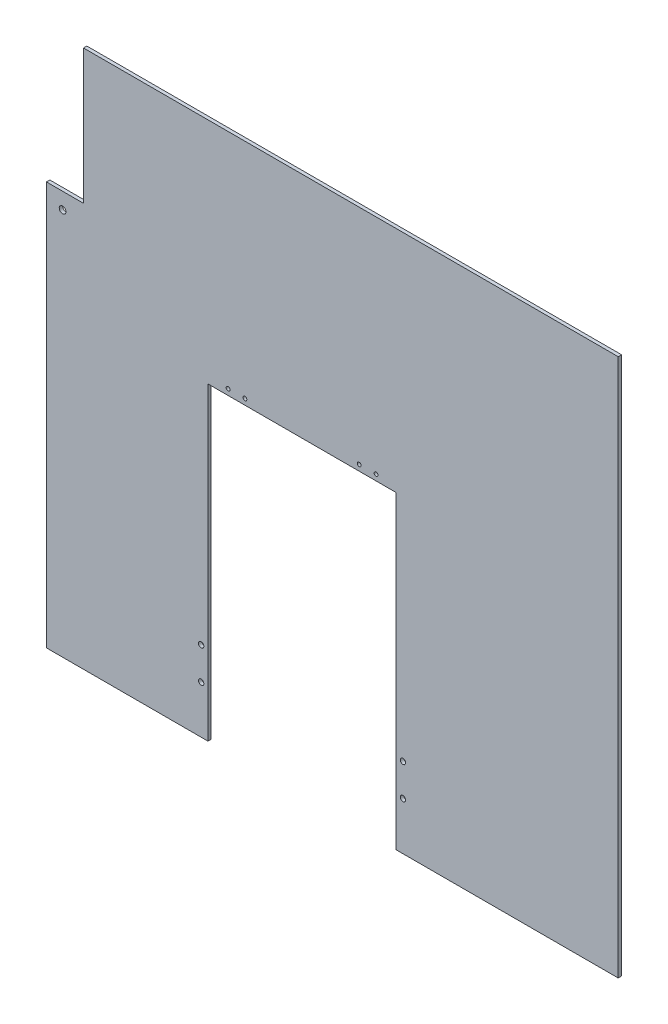
ISO-10303-21;
HEADER;
FILE_DESCRIPTION(('STEP AP214'),'2;1');
FILE_NAME('part.step','',(''),(''),'','','');
FILE_SCHEMA(('AUTOMOTIVE_DESIGN { 1 0 10303 214 1 1 1 1 }'));
ENDSEC;
DATA;
#1=APPLICATION_CONTEXT('core data for automotive mechanical design processes');
#2=APPLICATION_PROTOCOL_DEFINITION('international standard','automotive_design',2000,#1);
#3=PRODUCT_CONTEXT('',#1,'mechanical');
#4=PRODUCT('Part','Part','',(#3));
#5=PRODUCT_RELATED_PRODUCT_CATEGORY('part','',(#4));
#6=PRODUCT_DEFINITION_FORMATION('','',#4);
#7=PRODUCT_DEFINITION_CONTEXT('part definition',#1,'design');
#8=PRODUCT_DEFINITION('design','',#6,#7);
#9=PRODUCT_DEFINITION_SHAPE('','',#8);
#10=(LENGTH_UNIT() NAMED_UNIT(*) SI_UNIT(.MILLI.,.METRE.));
#11=(NAMED_UNIT(*) PLANE_ANGLE_UNIT() SI_UNIT($,.RADIAN.));
#12=(NAMED_UNIT(*) SI_UNIT($,.STERADIAN.) SOLID_ANGLE_UNIT());
#13=UNCERTAINTY_MEASURE_WITH_UNIT(LENGTH_MEASURE(1.E-05),#10,'distance_accuracy_value','');
#14=(GEOMETRIC_REPRESENTATION_CONTEXT(3) GLOBAL_UNCERTAINTY_ASSIGNED_CONTEXT((#13)) GLOBAL_UNIT_ASSIGNED_CONTEXT((#10,
#11,#12)) REPRESENTATION_CONTEXT('',''));
#15=CARTESIAN_POINT('',(0.,0.,0.));
#16=DIRECTION('',(0.,0.,1.));
#17=DIRECTION('',(1.,0.,0.));
#18=AXIS2_PLACEMENT_3D('',#15,#16,#17);
#19=CARTESIAN_POINT('',(0.,0.,3.175));
#20=DIRECTION('',(0.,1.,0.));
#21=DIRECTION('',(0.,0.,1.));
#22=AXIS2_PLACEMENT_3D('',#19,#20,#21);
#23=PLANE('',#22);
#24=DIRECTION('',(1.,0.,0.));
#25=VECTOR('',#24,1.);
#26=CARTESIAN_POINT('',(0.,0.,0.));
#27=LINE('',#26,#25);
#28=CARTESIAN_POINT('',(0.,0.,0.));
#29=VERTEX_POINT('',#28);
#30=CARTESIAN_POINT('',(152.4,0.,0.));
#31=VERTEX_POINT('',#30);
#32=EDGE_CURVE('E161',#29,#31,#27,.T.);
#33=ORIENTED_EDGE('',*,*,#32,.T.);
#34=DIRECTION('',(0.,0.,-1.));
#35=VECTOR('',#34,1.);
#36=CARTESIAN_POINT('',(152.4,0.,44.45));
#37=LINE('',#36,#35);
#38=CARTESIAN_POINT('',(152.4,0.,3.175));
#39=VERTEX_POINT('',#38);
#40=EDGE_CURVE('E216',#39,#31,#37,.T.);
#41=ORIENTED_EDGE('',*,*,#40,.F.);
#42=DIRECTION('',(1.,0.,0.));
#43=VECTOR('',#42,1.);
#44=CARTESIAN_POINT('',(0.,0.,3.175));
#45=LINE('',#44,#43);
#46=CARTESIAN_POINT('',(0.,0.,3.175));
#47=VERTEX_POINT('',#46);
#48=EDGE_CURVE('E152',#47,#39,#45,.T.);
#49=ORIENTED_EDGE('',*,*,#48,.F.);
#50=DIRECTION('',(0.,0.,-1.));
#51=VECTOR('',#50,1.);
#52=CARTESIAN_POINT('',(0.,0.,3.175));
#53=LINE('',#52,#51);
#54=EDGE_CURVE('E11',#47,#29,#53,.T.);
#55=ORIENTED_EDGE('',*,*,#54,.T.);
#56=EDGE_LOOP('',(#33,#41,#49,#55));
#57=FACE_BOUND('',#56,.T.);
#58=ADVANCED_FACE('F43',(#57),#23,.F.);
#59=CARTESIAN_POINT('',(0.,0.,3.175));
#60=DIRECTION('',(1.,0.,0.));
#61=DIRECTION('',(0.,0.,-1.));
#62=AXIS2_PLACEMENT_3D('',#59,#60,#61);
#63=PLANE('',#62);
#64=DIRECTION('',(0.,-1.,0.));
#65=VECTOR('',#64,1.);
#66=CARTESIAN_POINT('',(0.,0.,3.175));
#67=LINE('',#66,#65);
#68=CARTESIAN_POINT('',(0.,381.,3.175));
#69=VERTEX_POINT('',#68);
#70=EDGE_CURVE('E169',#69,#47,#67,.T.);
#71=ORIENTED_EDGE('',*,*,#70,.F.);
#72=DIRECTION('',(0.,0.,-1.));
#73=VECTOR('',#72,1.);
#74=CARTESIAN_POINT('',(0.,381.,3.175));
#75=LINE('',#74,#73);
#76=CARTESIAN_POINT('',(0.,381.,0.));
#77=VERTEX_POINT('',#76);
#78=EDGE_CURVE('E197',#69,#77,#75,.T.);
#79=ORIENTED_EDGE('',*,*,#78,.T.);
#80=DIRECTION('',(0.,-1.,0.));
#81=VECTOR('',#80,1.);
#82=CARTESIAN_POINT('',(0.,0.,0.));
#83=LINE('',#82,#81);
#84=EDGE_CURVE('E156',#77,#29,#83,.T.);
#85=ORIENTED_EDGE('',*,*,#84,.T.);
#86=ORIENTED_EDGE('',*,*,#54,.F.);
#87=EDGE_LOOP('',(#71,#79,#85,#86));
#88=FACE_BOUND('',#87,.T.);
#89=ADVANCED_FACE('F45',(#88),#63,.F.);
#90=CARTESIAN_POINT('',(330.2,0.,3.175));
#91=VERTEX_POINT('',#90);
#92=CARTESIAN_POINT('',(539.75,0.,3.175));
#93=VERTEX_POINT('',#92);
#94=EDGE_CURVE('E261',#91,#93,#45,.T.);
#95=ORIENTED_EDGE('',*,*,#94,.F.);
#96=DIRECTION('',(0.,0.,-1.));
#97=VECTOR('',#96,1.);
#98=CARTESIAN_POINT('',(330.2,0.,44.45));
#99=LINE('',#98,#97);
#100=CARTESIAN_POINT('',(330.2,0.,0.));
#101=VERTEX_POINT('',#100);
#102=EDGE_CURVE('E229',#91,#101,#99,.T.);
#103=ORIENTED_EDGE('',*,*,#102,.T.);
#104=CARTESIAN_POINT('',(539.75,0.,0.));
#105=VERTEX_POINT('',#104);
#106=EDGE_CURVE('E159',#101,#105,#27,.T.);
#107=ORIENTED_EDGE('',*,*,#106,.T.);
#108=DIRECTION('',(0.,0.,-1.));
#109=VECTOR('',#108,1.);
#110=CARTESIAN_POINT('',(539.75,0.,3.175));
#111=LINE('',#110,#109);
#112=EDGE_CURVE('E52',#93,#105,#111,.T.);
#113=ORIENTED_EDGE('',*,*,#112,.F.);
#114=EDGE_LOOP('',(#95,#103,#107,#113));
#115=FACE_BOUND('',#114,.T.);
#116=ADVANCED_FACE('F266',(#115),#23,.F.);
#117=CARTESIAN_POINT('',(539.75,0.,3.175));
#118=DIRECTION('',(-1.,0.,0.));
#119=DIRECTION('',(0.,0.,1.));
#120=AXIS2_PLACEMENT_3D('',#117,#118,#119);
#121=PLANE('',#120);
#122=DIRECTION('',(0.,1.,0.));
#123=VECTOR('',#122,1.);
#124=CARTESIAN_POINT('',(539.75,0.,0.));
#125=LINE('',#124,#123);
#126=CARTESIAN_POINT('',(539.75,508.,0.));
#127=VERTEX_POINT('',#126);
#128=EDGE_CURVE('E165',#105,#127,#125,.T.);
#129=ORIENTED_EDGE('',*,*,#128,.T.);
#130=DIRECTION('',(0.,0.,-1.));
#131=VECTOR('',#130,1.);
#132=CARTESIAN_POINT('',(539.75,508.,3.175));
#133=LINE('',#132,#131);
#134=CARTESIAN_POINT('',(539.75,508.,3.175));
#135=VERTEX_POINT('',#134);
#136=EDGE_CURVE('E147',#135,#127,#133,.T.);
#137=ORIENTED_EDGE('',*,*,#136,.F.);
#138=DIRECTION('',(0.,1.,0.));
#139=VECTOR('',#138,1.);
#140=CARTESIAN_POINT('',(539.75,0.,3.175));
#141=LINE('',#140,#139);
#142=EDGE_CURVE('E144',#93,#135,#141,.T.);
#143=ORIENTED_EDGE('',*,*,#142,.F.);
#144=ORIENTED_EDGE('',*,*,#112,.T.);
#145=EDGE_LOOP('',(#129,#137,#143,#144));
#146=FACE_BOUND('',#145,.T.);
#147=ADVANCED_FACE('F175',(#146),#121,.F.);
#148=CARTESIAN_POINT('',(0.,508.,3.175));
#149=DIRECTION('',(0.,-1.,0.));
#150=DIRECTION('',(0.,0.,-1.));
#151=AXIS2_PLACEMENT_3D('',#148,#149,#150);
#152=PLANE('',#151);
#153=DIRECTION('',(-1.,0.,0.));
#154=VECTOR('',#153,1.);
#155=CARTESIAN_POINT('',(0.,508.,0.));
#156=LINE('',#155,#154);
#157=CARTESIAN_POINT('',(34.925,508.,0.));
#158=VERTEX_POINT('',#157);
#159=EDGE_CURVE('E139',#127,#158,#156,.T.);
#160=ORIENTED_EDGE('',*,*,#159,.T.);
#161=DIRECTION('',(0.,0.,-1.));
#162=VECTOR('',#161,1.);
#163=CARTESIAN_POINT('',(34.925,508.,3.175));
#164=LINE('',#163,#162);
#165=CARTESIAN_POINT('',(34.925,508.,3.175));
#166=VERTEX_POINT('',#165);
#167=EDGE_CURVE('E59',#166,#158,#164,.T.);
#168=ORIENTED_EDGE('',*,*,#167,.F.);
#169=DIRECTION('',(-1.,0.,0.));
#170=VECTOR('',#169,1.);
#171=CARTESIAN_POINT('',(0.,508.,3.175));
#172=LINE('',#171,#170);
#173=EDGE_CURVE('E137',#135,#166,#172,.T.);
#174=ORIENTED_EDGE('',*,*,#173,.F.);
#175=ORIENTED_EDGE('',*,*,#136,.T.);
#176=EDGE_LOOP('',(#160,#168,#174,#175));
#177=FACE_BOUND('',#176,.T.);
#178=ADVANCED_FACE('F135',(#177),#152,.F.);
#179=CARTESIAN_POINT('',(0.,0.,3.175));
#180=DIRECTION('',(0.,0.,-1.));
#181=DIRECTION('',(-1.,0.,0.));
#182=AXIS2_PLACEMENT_3D('',#179,#180,#181);
#183=PLANE('',#182);
#184=CARTESIAN_POINT('',(336.55,75.565,3.175));
#185=DIRECTION('',(0.,0.,1.));
#186=DIRECTION('',(1.,0.,0.));
#187=AXIS2_PLACEMENT_3D('',#184,#185,#186);
#188=CIRCLE('',#187,2.54000000000001);
#189=CARTESIAN_POINT('',(339.09,75.565,3.175));
#190=VERTEX_POINT('',#189);
#191=EDGE_CURVE('E513',#190,#190,#188,.T.);
#192=ORIENTED_EDGE('',*,*,#191,.F.);
#193=EDGE_LOOP('',(#192));
#194=FACE_BOUND('',#193,.T.);
#195=CARTESIAN_POINT('',(146.05,75.565,3.175));
#196=DIRECTION('',(0.,0.,1.));
#197=DIRECTION('',(1.,0.,0.));
#198=AXIS2_PLACEMENT_3D('',#195,#196,#197);
#199=CIRCLE('',#198,2.53999999999998);
#200=CARTESIAN_POINT('',(148.59,75.565,3.175));
#201=VERTEX_POINT('',#200);
#202=EDGE_CURVE('E517',#201,#201,#199,.T.);
#203=ORIENTED_EDGE('',*,*,#202,.F.);
#204=EDGE_LOOP('',(#203));
#205=FACE_BOUND('',#204,.T.);
#206=CARTESIAN_POINT('',(311.1754,297.6372,3.175));
#207=DIRECTION('',(0.,0.,-1.));
#208=DIRECTION('',(-1.,0.,0.));
#209=AXIS2_PLACEMENT_3D('',#206,#207,#208);
#210=CIRCLE('',#209,1.80339999999999);
#211=CARTESIAN_POINT('',(309.372,297.6372,3.175));
#212=VERTEX_POINT('',#211);
#213=EDGE_CURVE('E187',#212,#212,#210,.T.);
#214=ORIENTED_EDGE('',*,*,#213,.T.);
#215=EDGE_LOOP('',(#214));
#216=FACE_BOUND('',#215,.T.);
#217=CARTESIAN_POINT('',(295.3004,297.6372,3.175));
#218=DIRECTION('',(0.,0.,-1.));
#219=DIRECTION('',(-1.,0.,0.));
#220=AXIS2_PLACEMENT_3D('',#217,#218,#219);
#221=CIRCLE('',#220,1.80340000000004);
#222=CARTESIAN_POINT('',(293.497,297.6372,3.175));
#223=VERTEX_POINT('',#222);
#224=EDGE_CURVE('E535',#223,#223,#221,.T.);
#225=ORIENTED_EDGE('',*,*,#224,.T.);
#226=EDGE_LOOP('',(#225));
#227=FACE_BOUND('',#226,.T.);
#228=CARTESIAN_POINT('',(187.3504,297.6372,3.175));
#229=DIRECTION('',(0.,0.,-1.));
#230=DIRECTION('',(-1.,0.,0.));
#231=AXIS2_PLACEMENT_3D('',#228,#229,#230);
#232=CIRCLE('',#231,1.80340000000004);
#233=CARTESIAN_POINT('',(185.547,297.6372,3.175));
#234=VERTEX_POINT('',#233);
#235=EDGE_CURVE('E543',#234,#234,#232,.T.);
#236=ORIENTED_EDGE('',*,*,#235,.T.);
#237=EDGE_LOOP('',(#236));
#238=FACE_BOUND('',#237,.T.);
#239=CARTESIAN_POINT('',(171.4754,297.6372,3.175));
#240=DIRECTION('',(0.,0.,-1.));
#241=DIRECTION('',(-1.,0.,0.));
#242=AXIS2_PLACEMENT_3D('',#239,#240,#241);
#243=CIRCLE('',#242,1.80340000000004);
#244=CARTESIAN_POINT('',(169.672,297.6372,3.175));
#245=VERTEX_POINT('',#244);
#246=EDGE_CURVE('E524',#245,#245,#243,.T.);
#247=ORIENTED_EDGE('',*,*,#246,.T.);
#248=EDGE_LOOP('',(#247));
#249=FACE_BOUND('',#248,.T.);
#250=CARTESIAN_POINT('',(336.55,45.085,3.175));
#251=DIRECTION('',(0.,0.,-1.));
#252=DIRECTION('',(-1.,0.,0.));
#253=AXIS2_PLACEMENT_3D('',#250,#251,#252);
#254=CIRCLE('',#253,2.54000000000001);
#255=CARTESIAN_POINT('',(334.01,45.085,3.175));
#256=VERTEX_POINT('',#255);
#257=EDGE_CURVE('E160',#256,#256,#254,.T.);
#258=ORIENTED_EDGE('',*,*,#257,.T.);
#259=EDGE_LOOP('',(#258));
#260=FACE_BOUND('',#259,.T.);
#261=CARTESIAN_POINT('',(146.05,45.085,3.175));
#262=DIRECTION('',(0.,0.,-1.));
#263=DIRECTION('',(-1.,0.,0.));
#264=AXIS2_PLACEMENT_3D('',#261,#262,#263);
#265=CIRCLE('',#264,2.53999999999998);
#266=CARTESIAN_POINT('',(143.51,45.085,3.175));
#267=VERTEX_POINT('',#266);
#268=EDGE_CURVE('E253',#267,#267,#265,.T.);
#269=ORIENTED_EDGE('',*,*,#268,.T.);
#270=EDGE_LOOP('',(#269));
#271=FACE_BOUND('',#270,.T.);
#272=CARTESIAN_POINT('',(15.24,365.76,3.175));
#273=DIRECTION('',(0.,0.,-1.));
#274=DIRECTION('',(-1.,0.,0.));
#275=AXIS2_PLACEMENT_3D('',#272,#273,#274);
#276=CIRCLE('',#275,3.175);
#277=CARTESIAN_POINT('',(12.065,365.76,3.175));
#278=VERTEX_POINT('',#277);
#279=EDGE_CURVE('E249',#278,#278,#276,.T.);
#280=ORIENTED_EDGE('',*,*,#279,.T.);
#281=EDGE_LOOP('',(#280));
#282=FACE_BOUND('',#281,.T.);
#283=DIRECTION('',(0.,-1.,0.));
#284=VECTOR('',#283,1.);
#285=CARTESIAN_POINT('',(34.925,508.,3.175));
#286=LINE('',#285,#284);
#287=CARTESIAN_POINT('',(34.925,381.,3.175));
#288=VERTEX_POINT('',#287);
#289=EDGE_CURVE('E121',#166,#288,#286,.T.);
#290=ORIENTED_EDGE('',*,*,#289,.T.);
#291=DIRECTION('',(-1.,0.,0.));
#292=VECTOR('',#291,1.);
#293=CARTESIAN_POINT('',(0.,381.,3.175));
#294=LINE('',#293,#292);
#295=EDGE_CURVE('E129',#288,#69,#294,.T.);
#296=ORIENTED_EDGE('',*,*,#295,.T.);
#297=ORIENTED_EDGE('',*,*,#70,.T.);
#298=ORIENTED_EDGE('',*,*,#48,.T.);
#299=DIRECTION('',(0.,1.,0.));
#300=VECTOR('',#299,1.);
#301=CARTESIAN_POINT('',(152.4,0.,3.175));
#302=LINE('',#301,#300);
#303=CARTESIAN_POINT('',(152.4,292.1,3.175));
#304=VERTEX_POINT('',#303);
#305=EDGE_CURVE('E245',#39,#304,#302,.T.);
#306=ORIENTED_EDGE('',*,*,#305,.T.);
#307=DIRECTION('',(1.,0.,0.));
#308=VECTOR('',#307,1.);
#309=CARTESIAN_POINT('',(0.,292.1,3.175));
#310=LINE('',#309,#308);
#311=CARTESIAN_POINT('',(330.2,292.1,3.175));
#312=VERTEX_POINT('',#311);
#313=EDGE_CURVE('E207',#304,#312,#310,.T.);
#314=ORIENTED_EDGE('',*,*,#313,.T.);
#315=DIRECTION('',(0.,-1.,0.));
#316=VECTOR('',#315,1.);
#317=CARTESIAN_POINT('',(330.2,0.,3.175));
#318=LINE('',#317,#316);
#319=EDGE_CURVE('E241',#312,#91,#318,.T.);
#320=ORIENTED_EDGE('',*,*,#319,.T.);
#321=ORIENTED_EDGE('',*,*,#94,.T.);
#322=ORIENTED_EDGE('',*,*,#142,.T.);
#323=ORIENTED_EDGE('',*,*,#173,.T.);
#324=EDGE_LOOP('',(#290,#296,#297,#298,#306,#314,#320,#321,#322,#323));
#325=FACE_BOUND('',#324,.T.);
#326=ADVANCED_FACE('F142',(#194,#205,#216,#227,#238,#249,#260,#271,#282,#325),#183,.F.);
#327=CARTESIAN_POINT('',(0.,0.,0.));
#328=DIRECTION('',(0.,0.,-1.));
#329=DIRECTION('',(-1.,0.,0.));
#330=AXIS2_PLACEMENT_3D('',#327,#328,#329);
#331=PLANE('',#330);
#332=CARTESIAN_POINT('',(336.55,75.565,0.));
#333=DIRECTION('',(0.,0.,1.));
#334=DIRECTION('',(1.,0.,0.));
#335=AXIS2_PLACEMENT_3D('',#332,#333,#334);
#336=CIRCLE('',#335,2.54000000000001);
#337=CARTESIAN_POINT('',(339.09,75.565,0.));
#338=VERTEX_POINT('',#337);
#339=EDGE_CURVE('E510',#338,#338,#336,.T.);
#340=ORIENTED_EDGE('',*,*,#339,.T.);
#341=EDGE_LOOP('',(#340));
#342=FACE_BOUND('',#341,.T.);
#343=CARTESIAN_POINT('',(146.05,75.565,0.));
#344=DIRECTION('',(0.,0.,1.));
#345=DIRECTION('',(1.,0.,0.));
#346=AXIS2_PLACEMENT_3D('',#343,#344,#345);
#347=CIRCLE('',#346,2.53999999999998);
#348=CARTESIAN_POINT('',(148.59,75.565,0.));
#349=VERTEX_POINT('',#348);
#350=EDGE_CURVE('E520',#349,#349,#347,.T.);
#351=ORIENTED_EDGE('',*,*,#350,.T.);
#352=EDGE_LOOP('',(#351));
#353=FACE_BOUND('',#352,.T.);
#354=CARTESIAN_POINT('',(311.1754,297.6372,0.));
#355=DIRECTION('',(0.,0.,-1.));
#356=DIRECTION('',(-1.,0.,0.));
#357=AXIS2_PLACEMENT_3D('',#354,#355,#356);
#358=CIRCLE('',#357,1.80339999999999);
#359=CARTESIAN_POINT('',(309.372,297.6372,0.));
#360=VERTEX_POINT('',#359);
#361=EDGE_CURVE('E193',#360,#360,#358,.T.);
#362=ORIENTED_EDGE('',*,*,#361,.F.);
#363=EDGE_LOOP('',(#362));
#364=FACE_BOUND('',#363,.T.);
#365=CARTESIAN_POINT('',(295.3004,297.6372,0.));
#366=DIRECTION('',(0.,0.,-1.));
#367=DIRECTION('',(-1.,0.,0.));
#368=AXIS2_PLACEMENT_3D('',#365,#366,#367);
#369=CIRCLE('',#368,1.80340000000004);
#370=CARTESIAN_POINT('',(293.497,297.6372,0.));
#371=VERTEX_POINT('',#370);
#372=EDGE_CURVE('E531',#371,#371,#369,.T.);
#373=ORIENTED_EDGE('',*,*,#372,.F.);
#374=EDGE_LOOP('',(#373));
#375=FACE_BOUND('',#374,.T.);
#376=CARTESIAN_POINT('',(187.3504,297.6372,0.));
#377=DIRECTION('',(0.,0.,-1.));
#378=DIRECTION('',(-1.,0.,0.));
#379=AXIS2_PLACEMENT_3D('',#376,#377,#378);
#380=CIRCLE('',#379,1.80340000000004);
#381=CARTESIAN_POINT('',(185.547,297.6372,0.));
#382=VERTEX_POINT('',#381);
#383=EDGE_CURVE('E539',#382,#382,#380,.T.);
#384=ORIENTED_EDGE('',*,*,#383,.F.);
#385=EDGE_LOOP('',(#384));
#386=FACE_BOUND('',#385,.T.);
#387=CARTESIAN_POINT('',(171.4754,297.6372,0.));
#388=DIRECTION('',(0.,0.,-1.));
#389=DIRECTION('',(-1.,0.,0.));
#390=AXIS2_PLACEMENT_3D('',#387,#388,#389);
#391=CIRCLE('',#390,1.80340000000004);
#392=CARTESIAN_POINT('',(169.672,297.6372,0.));
#393=VERTEX_POINT('',#392);
#394=EDGE_CURVE('E547',#393,#393,#391,.T.);
#395=ORIENTED_EDGE('',*,*,#394,.F.);
#396=EDGE_LOOP('',(#395));
#397=FACE_BOUND('',#396,.T.);
#398=DIRECTION('',(-1.,0.,0.));
#399=VECTOR('',#398,1.);
#400=CARTESIAN_POINT('',(0.,381.,0.));
#401=LINE('',#400,#399);
#402=CARTESIAN_POINT('',(34.925,381.,0.));
#403=VERTEX_POINT('',#402);
#404=EDGE_CURVE('E130',#403,#77,#401,.T.);
#405=ORIENTED_EDGE('',*,*,#404,.F.);
#406=DIRECTION('',(0.,-1.,0.));
#407=VECTOR('',#406,1.);
#408=CARTESIAN_POINT('',(34.925,508.,0.));
#409=LINE('',#408,#407);
#410=EDGE_CURVE('E184',#158,#403,#409,.T.);
#411=ORIENTED_EDGE('',*,*,#410,.F.);
#412=ORIENTED_EDGE('',*,*,#159,.F.);
#413=ORIENTED_EDGE('',*,*,#128,.F.);
#414=ORIENTED_EDGE('',*,*,#106,.F.);
#415=DIRECTION('',(0.,-1.,0.));
#416=VECTOR('',#415,1.);
#417=CARTESIAN_POINT('',(330.2,0.,0.));
#418=LINE('',#417,#416);
#419=CARTESIAN_POINT('',(330.2,292.1,0.));
#420=VERTEX_POINT('',#419);
#421=EDGE_CURVE('E223',#420,#101,#418,.T.);
#422=ORIENTED_EDGE('',*,*,#421,.F.);
#423=DIRECTION('',(1.,0.,0.));
#424=VECTOR('',#423,1.);
#425=CARTESIAN_POINT('',(152.4,292.1,0.));
#426=LINE('',#425,#424);
#427=CARTESIAN_POINT('',(152.4,292.1,0.));
#428=VERTEX_POINT('',#427);
#429=EDGE_CURVE('E219',#428,#420,#426,.T.);
#430=ORIENTED_EDGE('',*,*,#429,.F.);
#431=DIRECTION('',(0.,1.,0.));
#432=VECTOR('',#431,1.);
#433=CARTESIAN_POINT('',(152.4,0.,0.));
#434=LINE('',#433,#432);
#435=EDGE_CURVE('E67',#31,#428,#434,.T.);
#436=ORIENTED_EDGE('',*,*,#435,.F.);
#437=ORIENTED_EDGE('',*,*,#32,.F.);
#438=ORIENTED_EDGE('',*,*,#84,.F.);
#439=EDGE_LOOP('',(#405,#411,#412,#413,#414,#422,#430,#436,#437,#438));
#440=FACE_BOUND('',#439,.T.);
#441=CARTESIAN_POINT('',(336.55,45.085,0.));
#442=DIRECTION('',(0.,0.,-1.));
#443=DIRECTION('',(-1.,0.,0.));
#444=AXIS2_PLACEMENT_3D('',#441,#442,#443);
#445=CIRCLE('',#444,2.54000000000001);
#446=CARTESIAN_POINT('',(334.01,45.085,0.));
#447=VERTEX_POINT('',#446);
#448=EDGE_CURVE('E203',#447,#447,#445,.T.);
#449=ORIENTED_EDGE('',*,*,#448,.F.);
#450=EDGE_LOOP('',(#449));
#451=FACE_BOUND('',#450,.T.);
#452=CARTESIAN_POINT('',(146.05,45.085,0.));
#453=DIRECTION('',(0.,0.,-1.));
#454=DIRECTION('',(-1.,0.,0.));
#455=AXIS2_PLACEMENT_3D('',#452,#453,#454);
#456=CIRCLE('',#455,2.53999999999998);
#457=CARTESIAN_POINT('',(143.51,45.085,0.));
#458=VERTEX_POINT('',#457);
#459=EDGE_CURVE('E208',#458,#458,#456,.T.);
#460=ORIENTED_EDGE('',*,*,#459,.F.);
#461=EDGE_LOOP('',(#460));
#462=FACE_BOUND('',#461,.T.);
#463=CARTESIAN_POINT('',(15.24,365.76,0.));
#464=DIRECTION('',(0.,0.,-1.));
#465=DIRECTION('',(-1.,0.,0.));
#466=AXIS2_PLACEMENT_3D('',#463,#464,#465);
#467=CIRCLE('',#466,3.175);
#468=CARTESIAN_POINT('',(12.065,365.76,0.));
#469=VERTEX_POINT('',#468);
#470=EDGE_CURVE('E212',#469,#469,#467,.T.);
#471=ORIENTED_EDGE('',*,*,#470,.F.);
#472=EDGE_LOOP('',(#471));
#473=FACE_BOUND('',#472,.T.);
#474=ADVANCED_FACE('F181',(#342,#353,#364,#375,#386,#397,#440,#451,#462,#473),#331,.T.);
#475=CARTESIAN_POINT('',(152.4,0.,44.45));
#476=DIRECTION('',(-1.,0.,0.));
#477=DIRECTION('',(0.,0.,1.));
#478=AXIS2_PLACEMENT_3D('',#475,#476,#477);
#479=PLANE('',#478);
#480=ORIENTED_EDGE('',*,*,#40,.T.);
#481=ORIENTED_EDGE('',*,*,#435,.T.);
#482=DIRECTION('',(0.,0.,-1.));
#483=VECTOR('',#482,1.);
#484=CARTESIAN_POINT('',(152.4,292.1,44.45));
#485=LINE('',#484,#483);
#486=EDGE_CURVE('E226',#304,#428,#485,.T.);
#487=ORIENTED_EDGE('',*,*,#486,.F.);
#488=ORIENTED_EDGE('',*,*,#305,.F.);
#489=EDGE_LOOP('',(#480,#481,#487,#488));
#490=FACE_BOUND('',#489,.T.);
#491=ADVANCED_FACE('F274',(#490),#479,.F.);
#492=CARTESIAN_POINT('',(330.2,0.,44.45));
#493=DIRECTION('',(1.,0.,0.));
#494=DIRECTION('',(0.,0.,-1.));
#495=AXIS2_PLACEMENT_3D('',#492,#493,#494);
#496=PLANE('',#495);
#497=DIRECTION('',(0.,0.,-1.));
#498=VECTOR('',#497,1.);
#499=CARTESIAN_POINT('',(330.2,292.1,44.45));
#500=LINE('',#499,#498);
#501=EDGE_CURVE('E233',#312,#420,#500,.T.);
#502=ORIENTED_EDGE('',*,*,#501,.T.);
#503=ORIENTED_EDGE('',*,*,#421,.T.);
#504=ORIENTED_EDGE('',*,*,#102,.F.);
#505=ORIENTED_EDGE('',*,*,#319,.F.);
#506=EDGE_LOOP('',(#502,#503,#504,#505));
#507=FACE_BOUND('',#506,.T.);
#508=ADVANCED_FACE('F268',(#507),#496,.F.);
#509=CARTESIAN_POINT('',(152.4,292.1,44.45));
#510=DIRECTION('',(0.,1.,0.));
#511=DIRECTION('',(0.,0.,1.));
#512=AXIS2_PLACEMENT_3D('',#509,#510,#511);
#513=PLANE('',#512);
#514=ORIENTED_EDGE('',*,*,#486,.T.);
#515=ORIENTED_EDGE('',*,*,#429,.T.);
#516=ORIENTED_EDGE('',*,*,#501,.F.);
#517=ORIENTED_EDGE('',*,*,#313,.F.);
#518=EDGE_LOOP('',(#514,#515,#516,#517));
#519=FACE_BOUND('',#518,.T.);
#520=ADVANCED_FACE('F273',(#519),#513,.F.);
#521=CARTESIAN_POINT('',(15.24,365.76,44.45));
#522=DIRECTION('',(0.,0.,-1.));
#523=DIRECTION('',(-1.,0.,0.));
#524=AXIS2_PLACEMENT_3D('',#521,#522,#523);
#525=CYLINDRICAL_SURFACE('',#524,3.175);
#526=ORIENTED_EDGE('',*,*,#470,.T.);
#527=EDGE_LOOP('',(#526));
#528=FACE_BOUND('',#527,.T.);
#529=ORIENTED_EDGE('',*,*,#279,.F.);
#530=EDGE_LOOP('',(#529));
#531=FACE_BOUND('',#530,.T.);
#532=ADVANCED_FACE('F321',(#528,#531),#525,.F.);
#533=CARTESIAN_POINT('',(146.05,45.085,44.45));
#534=DIRECTION('',(0.,0.,-1.));
#535=DIRECTION('',(-1.,0.,0.));
#536=AXIS2_PLACEMENT_3D('',#533,#534,#535);
#537=CYLINDRICAL_SURFACE('',#536,2.53999999999998);
#538=ORIENTED_EDGE('',*,*,#459,.T.);
#539=EDGE_LOOP('',(#538));
#540=FACE_BOUND('',#539,.T.);
#541=ORIENTED_EDGE('',*,*,#268,.F.);
#542=EDGE_LOOP('',(#541));
#543=FACE_BOUND('',#542,.T.);
#544=ADVANCED_FACE('F293',(#540,#543),#537,.F.);
#545=CARTESIAN_POINT('',(336.55,45.085,44.45));
#546=DIRECTION('',(0.,0.,-1.));
#547=DIRECTION('',(-1.,0.,0.));
#548=AXIS2_PLACEMENT_3D('',#545,#546,#547);
#549=CYLINDRICAL_SURFACE('',#548,2.54000000000001);
#550=ORIENTED_EDGE('',*,*,#448,.T.);
#551=EDGE_LOOP('',(#550));
#552=FACE_BOUND('',#551,.T.);
#553=ORIENTED_EDGE('',*,*,#257,.F.);
#554=EDGE_LOOP('',(#553));
#555=FACE_BOUND('',#554,.T.);
#556=ADVANCED_FACE('F285',(#552,#555),#549,.F.);
#557=CARTESIAN_POINT('',(0.,381.,3.175));
#558=DIRECTION('',(0.,-1.,0.));
#559=DIRECTION('',(0.,0.,-1.));
#560=AXIS2_PLACEMENT_3D('',#557,#558,#559);
#561=PLANE('',#560);
#562=ORIENTED_EDGE('',*,*,#404,.T.);
#563=ORIENTED_EDGE('',*,*,#78,.F.);
#564=ORIENTED_EDGE('',*,*,#295,.F.);
#565=DIRECTION('',(0.,0.,-1.));
#566=VECTOR('',#565,1.);
#567=CARTESIAN_POINT('',(34.925,381.,3.175));
#568=LINE('',#567,#566);
#569=EDGE_CURVE('E123',#288,#403,#568,.T.);
#570=ORIENTED_EDGE('',*,*,#569,.T.);
#571=EDGE_LOOP('',(#562,#563,#564,#570));
#572=FACE_BOUND('',#571,.T.);
#573=ADVANCED_FACE('F281',(#572),#561,.F.);
#574=CARTESIAN_POINT('',(34.925,508.,3.175));
#575=DIRECTION('',(1.,0.,0.));
#576=DIRECTION('',(0.,1.,0.));
#577=AXIS2_PLACEMENT_3D('',#574,#575,#576);
#578=PLANE('',#577);
#579=ORIENTED_EDGE('',*,*,#410,.T.);
#580=ORIENTED_EDGE('',*,*,#569,.F.);
#581=ORIENTED_EDGE('',*,*,#289,.F.);
#582=ORIENTED_EDGE('',*,*,#167,.T.);
#583=EDGE_LOOP('',(#579,#580,#581,#582));
#584=FACE_BOUND('',#583,.T.);
#585=ADVANCED_FACE('F122',(#584),#578,.F.);
#586=CARTESIAN_POINT('',(171.4754,297.6372,3.175));
#587=DIRECTION('',(0.,0.,-1.));
#588=DIRECTION('',(-1.,0.,0.));
#589=AXIS2_PLACEMENT_3D('',#586,#587,#588);
#590=CYLINDRICAL_SURFACE('',#589,1.80340000000004);
#591=ORIENTED_EDGE('',*,*,#246,.F.);
#592=EDGE_LOOP('',(#591));
#593=FACE_BOUND('',#592,.T.);
#594=ORIENTED_EDGE('',*,*,#394,.T.);
#595=EDGE_LOOP('',(#594));
#596=FACE_BOUND('',#595,.T.);
#597=ADVANCED_FACE('F291',(#593,#596),#590,.F.);
#598=CARTESIAN_POINT('',(187.3504,297.6372,3.175));
#599=DIRECTION('',(0.,0.,-1.));
#600=DIRECTION('',(-1.,0.,0.));
#601=AXIS2_PLACEMENT_3D('',#598,#599,#600);
#602=CYLINDRICAL_SURFACE('',#601,1.80340000000004);
#603=ORIENTED_EDGE('',*,*,#235,.F.);
#604=EDGE_LOOP('',(#603));
#605=FACE_BOUND('',#604,.T.);
#606=ORIENTED_EDGE('',*,*,#383,.T.);
#607=EDGE_LOOP('',(#606));
#608=FACE_BOUND('',#607,.T.);
#609=ADVANCED_FACE('F384',(#605,#608),#602,.F.);
#610=CARTESIAN_POINT('',(295.3004,297.6372,3.175));
#611=DIRECTION('',(0.,0.,-1.));
#612=DIRECTION('',(-1.,0.,0.));
#613=AXIS2_PLACEMENT_3D('',#610,#611,#612);
#614=CYLINDRICAL_SURFACE('',#613,1.80340000000004);
#615=ORIENTED_EDGE('',*,*,#224,.F.);
#616=EDGE_LOOP('',(#615));
#617=FACE_BOUND('',#616,.T.);
#618=ORIENTED_EDGE('',*,*,#372,.T.);
#619=EDGE_LOOP('',(#618));
#620=FACE_BOUND('',#619,.T.);
#621=ADVANCED_FACE('F394',(#617,#620),#614,.F.);
#622=CARTESIAN_POINT('',(311.1754,297.6372,3.175));
#623=DIRECTION('',(0.,0.,-1.));
#624=DIRECTION('',(-1.,0.,0.));
#625=AXIS2_PLACEMENT_3D('',#622,#623,#624);
#626=CYLINDRICAL_SURFACE('',#625,1.80339999999999);
#627=ORIENTED_EDGE('',*,*,#213,.F.);
#628=EDGE_LOOP('',(#627));
#629=FACE_BOUND('',#628,.T.);
#630=ORIENTED_EDGE('',*,*,#361,.T.);
#631=EDGE_LOOP('',(#630));
#632=FACE_BOUND('',#631,.T.);
#633=ADVANCED_FACE('F405',(#629,#632),#626,.F.);
#634=CARTESIAN_POINT('',(146.05,75.565,0.));
#635=DIRECTION('',(0.,0.,1.));
#636=DIRECTION('',(1.,0.,0.));
#637=AXIS2_PLACEMENT_3D('',#634,#635,#636);
#638=CYLINDRICAL_SURFACE('',#637,2.53999999999998);
#639=ORIENTED_EDGE('',*,*,#350,.F.);
#640=EDGE_LOOP('',(#639));
#641=FACE_BOUND('',#640,.T.);
#642=ORIENTED_EDGE('',*,*,#202,.T.);
#643=EDGE_LOOP('',(#642));
#644=FACE_BOUND('',#643,.T.);
#645=ADVANCED_FACE('F416',(#641,#644),#638,.F.);
#646=CARTESIAN_POINT('',(336.55,75.565,0.));
#647=DIRECTION('',(0.,0.,1.));
#648=DIRECTION('',(1.,0.,0.));
#649=AXIS2_PLACEMENT_3D('',#646,#647,#648);
#650=CYLINDRICAL_SURFACE('',#649,2.54000000000001);
#651=ORIENTED_EDGE('',*,*,#339,.F.);
#652=EDGE_LOOP('',(#651));
#653=FACE_BOUND('',#652,.T.);
#654=ORIENTED_EDGE('',*,*,#191,.T.);
#655=EDGE_LOOP('',(#654));
#656=FACE_BOUND('',#655,.T.);
#657=ADVANCED_FACE('F427',(#653,#656),#650,.F.);
#658=CLOSED_SHELL('',(#58,#89,#116,#147,#178,#326,#474,#491,#508,#520,#532,#544,#556,#573,#585,
#597,#609,#621,#633,#645,#657));
#659=MANIFOLD_SOLID_BREP('B2',#658);
#660=ADVANCED_BREP_SHAPE_REPRESENTATION('',(#18,#659),#14);
#661=SHAPE_DEFINITION_REPRESENTATION(#9,#660);
ENDSEC;
END-ISO-10303-21;
